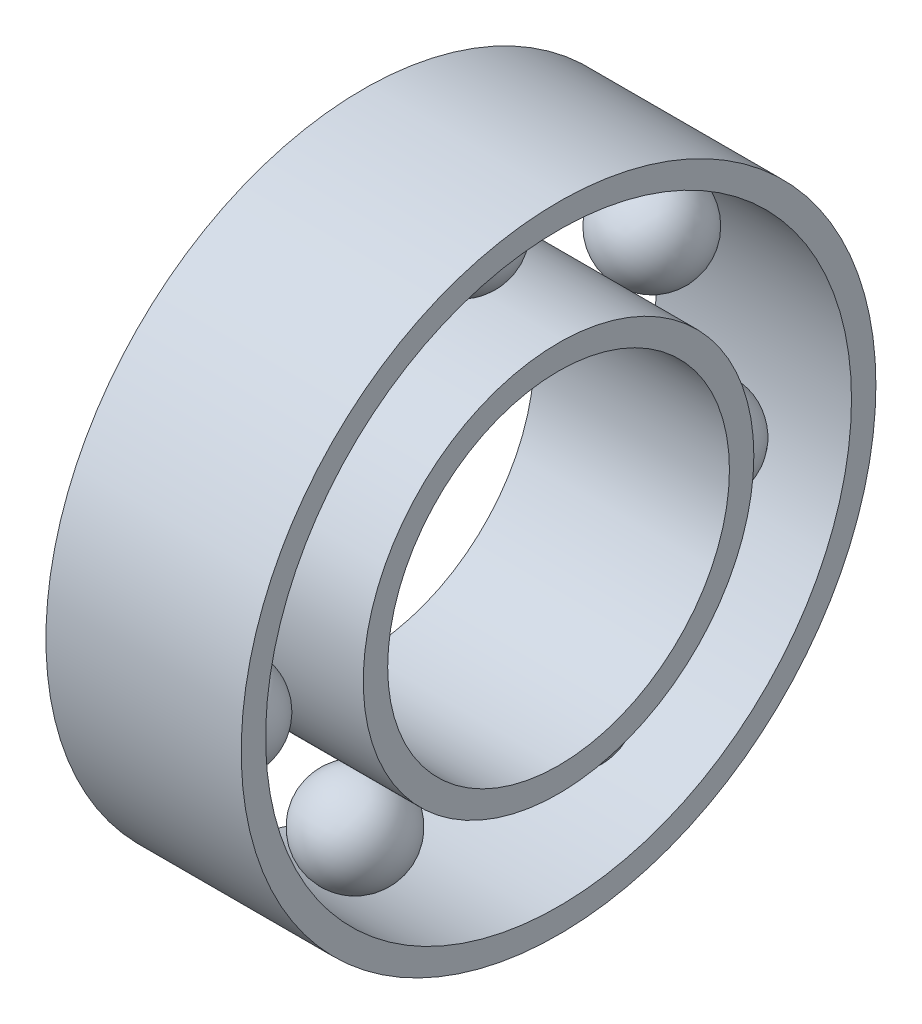
ISO-10303-21;
HEADER;
FILE_DESCRIPTION(('STEP AP214'),'2;1');
FILE_NAME('part.step','',(''),(''),'','','');
FILE_SCHEMA(('AUTOMOTIVE_DESIGN { 1 0 10303 214 1 1 1 1 }'));
ENDSEC;
DATA;
#1=APPLICATION_CONTEXT('core data for automotive mechanical design processes');
#2=APPLICATION_PROTOCOL_DEFINITION('international standard','automotive_design',2000,#1);
#3=PRODUCT_CONTEXT('',#1,'mechanical');
#4=PRODUCT('Part','Part','',(#3));
#5=PRODUCT_RELATED_PRODUCT_CATEGORY('part','',(#4));
#6=PRODUCT_DEFINITION_FORMATION('','',#4);
#7=PRODUCT_DEFINITION_CONTEXT('part definition',#1,'design');
#8=PRODUCT_DEFINITION('design','',#6,#7);
#9=PRODUCT_DEFINITION_SHAPE('','',#8);
#10=(LENGTH_UNIT() NAMED_UNIT(*) SI_UNIT(.MILLI.,.METRE.));
#11=(NAMED_UNIT(*) PLANE_ANGLE_UNIT() SI_UNIT($,.RADIAN.));
#12=(NAMED_UNIT(*) SI_UNIT($,.STERADIAN.) SOLID_ANGLE_UNIT());
#13=UNCERTAINTY_MEASURE_WITH_UNIT(LENGTH_MEASURE(1.E-05),#10,'distance_accuracy_value','');
#14=(GEOMETRIC_REPRESENTATION_CONTEXT(3) GLOBAL_UNCERTAINTY_ASSIGNED_CONTEXT((#13)) GLOBAL_UNIT_ASSIGNED_CONTEXT((#10,
#11,#12)) REPRESENTATION_CONTEXT('',''));
#15=CARTESIAN_POINT('',(0.,0.,0.));
#16=DIRECTION('',(0.,0.,1.));
#17=DIRECTION('',(1.,0.,0.));
#18=AXIS2_PLACEMENT_3D('',#15,#16,#17);
#19=CARTESIAN_POINT('',(0.,3.11744900929372,-3.90915741234011));
#20=DIRECTION('',(0.,-0.623489801858743,0.781831482468022));
#21=DIRECTION('',(0.,0.781831482468022,0.623489801858743));
#22=AXIS2_PLACEMENT_3D('',#19,#20,#21);
#23=SPHERICAL_SURFACE('',#22,1.);
#24=CARTESIAN_POINT('',(0.,2.49395920743497,-3.12732592987209));
#25=VERTEX_POINT('',#24);
#26=VERTEX_LOOP('',#25);
#27=FACE_BOUND('',#26,.T.);
#28=ADVANCED_FACE('F57',(#27),#23,.T.);
#29=CLOSED_SHELL('',(#28));
#30=MANIFOLD_SOLID_BREP('B2',#29);
#31=CARTESIAN_POINT('',(0.,-1.11260466978153,-4.87463956090913));
#32=DIRECTION('',(0.,0.222520933956305,0.974927912181826));
#33=DIRECTION('',(0.,0.974927912181826,-0.222520933956305));
#34=AXIS2_PLACEMENT_3D('',#31,#32,#33);
#35=SPHERICAL_SURFACE('',#34,1.);
#36=CARTESIAN_POINT('',(0.,-0.89008373582522,-3.8997116487273));
#37=VERTEX_POINT('',#36);
#38=VERTEX_LOOP('',#37);
#39=FACE_BOUND('',#38,.T.);
#40=ADVANCED_FACE('F71',(#39),#35,.T.);
#41=CLOSED_SHELL('',(#40));
#42=MANIFOLD_SOLID_BREP('B7',#41);
#43=CARTESIAN_POINT('',(0.,-4.50484433951208,-2.16941869558783));
#44=DIRECTION('',(0.,0.900968867902416,0.433883739117565));
#45=DIRECTION('',(0.,0.433883739117565,-0.900968867902416));
#46=AXIS2_PLACEMENT_3D('',#43,#44,#45);
#47=SPHERICAL_SURFACE('',#46,1.);
#48=CARTESIAN_POINT('',(0.,-3.60387547160966,-1.73553495647026));
#49=VERTEX_POINT('',#48);
#50=VERTEX_LOOP('',#49);
#51=FACE_BOUND('',#50,.T.);
#52=ADVANCED_FACE('F89',(#51),#47,.T.);
#53=CLOSED_SHELL('',(#52));
#54=MANIFOLD_SOLID_BREP('B55',#53);
#55=CARTESIAN_POINT('',(0.,-4.50484433951211,2.16941869558776));
#56=DIRECTION('',(0.,0.900968867902422,-0.433883739117553));
#57=DIRECTION('',(0.,-0.433883739117553,-0.900968867902422));
#58=AXIS2_PLACEMENT_3D('',#55,#56,#57);
#59=SPHERICAL_SURFACE('',#58,1.);
#60=CARTESIAN_POINT('',(0.,-3.60387547160969,1.73553495647021));
#61=VERTEX_POINT('',#60);
#62=VERTEX_LOOP('',#61);
#63=FACE_BOUND('',#62,.T.);
#64=ADVANCED_FACE('F110',(#63),#59,.T.);
#65=CLOSED_SHELL('',(#64));
#66=MANIFOLD_SOLID_BREP('B70',#65);
#67=CARTESIAN_POINT('',(0.,-1.11260466978159,4.87463956090911));
#68=DIRECTION('',(0.,0.222520933956318,-0.974927912181823));
#69=DIRECTION('',(0.,-0.974927912181823,-0.222520933956318));
#70=AXIS2_PLACEMENT_3D('',#67,#68,#69);
#71=SPHERICAL_SURFACE('',#70,1.);
#72=CARTESIAN_POINT('',(0.,-0.890083735825273,3.89971164872729));
#73=VERTEX_POINT('',#72);
#74=VERTEX_LOOP('',#73);
#75=FACE_BOUND('',#74,.T.);
#76=ADVANCED_FACE('F125',(#75),#71,.T.);
#77=CLOSED_SHELL('',(#76));
#78=MANIFOLD_SOLID_BREP('B88',#77);
#79=CARTESIAN_POINT('',(0.,3.11744900929366,3.90915741234016));
#80=DIRECTION('',(0.,-0.623489801858732,-0.781831482468031));
#81=DIRECTION('',(0.,-0.781831482468031,0.623489801858732));
#82=AXIS2_PLACEMENT_3D('',#79,#80,#81);
#83=SPHERICAL_SURFACE('',#82,1.);
#84=CARTESIAN_POINT('',(0.,2.49395920743493,3.12732592987212));
#85=VERTEX_POINT('',#84);
#86=VERTEX_LOOP('',#85);
#87=FACE_BOUND('',#86,.T.);
#88=ADVANCED_FACE('F143',(#87),#83,.T.);
#89=CLOSED_SHELL('',(#88));
#90=MANIFOLD_SOLID_BREP('B103',#89);
#91=CARTESIAN_POINT('',(0.,5.,0.));
#92=DIRECTION('',(0.,-1.,0.));
#93=DIRECTION('',(0.,0.,1.));
#94=AXIS2_PLACEMENT_3D('',#91,#92,#93);
#95=SPHERICAL_SURFACE('',#94,1.);
#96=CARTESIAN_POINT('',(0.,4.,0.));
#97=VERTEX_POINT('',#96);
#98=VERTEX_LOOP('',#97);
#99=FACE_BOUND('',#98,.T.);
#100=ADVANCED_FACE('F165',(#99),#95,.T.);
#101=CLOSED_SHELL('',(#100));
#102=MANIFOLD_SOLID_BREP('B116',#101);
#103=CARTESIAN_POINT('',(-2.,0.,0.));
#104=DIRECTION('',(1.,0.,0.));
#105=DIRECTION('',(0.,0.,-1.));
#106=AXIS2_PLACEMENT_3D('',#103,#104,#105);
#107=CYLINDRICAL_SURFACE('',#106,6.);
#108=CARTESIAN_POINT('',(0.,6.,0.));
#109=VERTEX_POINT('',#108);
#110=VERTEX_LOOP('',#109);
#111=FACE_BOUND('',#110,.T.);
#112=CARTESIAN_POINT('',(-2.,0.,0.));
#113=DIRECTION('',(1.,0.,0.));
#114=DIRECTION('',(0.,0.,-1.));
#115=AXIS2_PLACEMENT_3D('',#112,#113,#114);
#116=CIRCLE('',#115,6.);
#117=CARTESIAN_POINT('',(-2.,0.,-6.));
#118=VERTEX_POINT('',#117);
#119=EDGE_CURVE('E187',#118,#118,#116,.T.);
#120=ORIENTED_EDGE('',*,*,#119,.F.);
#121=EDGE_LOOP('',(#120));
#122=FACE_BOUND('',#121,.T.);
#123=CARTESIAN_POINT('',(2.,0.,0.));
#124=DIRECTION('',(1.,0.,0.));
#125=DIRECTION('',(0.,0.,-1.));
#126=AXIS2_PLACEMENT_3D('',#123,#124,#125);
#127=CIRCLE('',#126,6.);
#128=CARTESIAN_POINT('',(2.,0.,-6.));
#129=VERTEX_POINT('',#128);
#130=EDGE_CURVE('E200',#129,#129,#127,.T.);
#131=ORIENTED_EDGE('',*,*,#130,.T.);
#132=EDGE_LOOP('',(#131));
#133=FACE_BOUND('',#132,.T.);
#134=ADVANCED_FACE('F185',(#111,#122,#133),#107,.F.);
#135=CARTESIAN_POINT('',(-2.,0.,0.));
#136=DIRECTION('',(1.,0.,0.));
#137=DIRECTION('',(0.,0.,-1.));
#138=AXIS2_PLACEMENT_3D('',#135,#136,#137);
#139=CYLINDRICAL_SURFACE('',#138,6.5);
#140=CARTESIAN_POINT('',(-2.,0.,0.));
#141=DIRECTION('',(1.,0.,0.));
#142=DIRECTION('',(0.,0.,-1.));
#143=AXIS2_PLACEMENT_3D('',#140,#141,#142);
#144=CIRCLE('',#143,6.5);
#145=CARTESIAN_POINT('',(-2.,0.,-6.5));
#146=VERTEX_POINT('',#145);
#147=EDGE_CURVE('E159',#146,#146,#144,.T.);
#148=ORIENTED_EDGE('',*,*,#147,.T.);
#149=EDGE_LOOP('',(#148));
#150=FACE_BOUND('',#149,.T.);
#151=CARTESIAN_POINT('',(2.,0.,0.));
#152=DIRECTION('',(1.,0.,0.));
#153=DIRECTION('',(0.,0.,-1.));
#154=AXIS2_PLACEMENT_3D('',#151,#152,#153);
#155=CIRCLE('',#154,6.5);
#156=CARTESIAN_POINT('',(2.,0.,-6.5));
#157=VERTEX_POINT('',#156);
#158=EDGE_CURVE('E203',#157,#157,#155,.T.);
#159=ORIENTED_EDGE('',*,*,#158,.F.);
#160=EDGE_LOOP('',(#159));
#161=FACE_BOUND('',#160,.T.);
#162=ADVANCED_FACE('F192',(#150,#161),#139,.T.);
#163=CARTESIAN_POINT('',(-2.,0.,0.));
#164=DIRECTION('',(1.,0.,0.));
#165=DIRECTION('',(0.,0.,-1.));
#166=AXIS2_PLACEMENT_3D('',#163,#164,#165);
#167=PLANE('',#166);
#168=ORIENTED_EDGE('',*,*,#119,.T.);
#169=EDGE_LOOP('',(#168));
#170=FACE_BOUND('',#169,.T.);
#171=ORIENTED_EDGE('',*,*,#147,.F.);
#172=EDGE_LOOP('',(#171));
#173=FACE_BOUND('',#172,.T.);
#174=ADVANCED_FACE('F206',(#170,#173),#167,.F.);
#175=CARTESIAN_POINT('',(2.,0.,0.));
#176=DIRECTION('',(1.,0.,0.));
#177=DIRECTION('',(0.,0.,-1.));
#178=AXIS2_PLACEMENT_3D('',#175,#176,#177);
#179=PLANE('',#178);
#180=ORIENTED_EDGE('',*,*,#130,.F.);
#181=EDGE_LOOP('',(#180));
#182=FACE_BOUND('',#181,.T.);
#183=ORIENTED_EDGE('',*,*,#158,.T.);
#184=EDGE_LOOP('',(#183));
#185=FACE_BOUND('',#184,.T.);
#186=ADVANCED_FACE('F207',(#182,#185),#179,.T.);
#187=CLOSED_SHELL('',(#134,#162,#174,#186));
#188=MANIFOLD_SOLID_BREP('B139',#187);
#189=CARTESIAN_POINT('',(-2.,0.,0.));
#190=DIRECTION('',(1.,0.,0.));
#191=DIRECTION('',(0.,0.,-1.));
#192=AXIS2_PLACEMENT_3D('',#189,#190,#191);
#193=CYLINDRICAL_SURFACE('',#192,3.5);
#194=CARTESIAN_POINT('',(-2.,0.,0.));
#195=DIRECTION('',(1.,0.,0.));
#196=DIRECTION('',(0.,0.,-1.));
#197=AXIS2_PLACEMENT_3D('',#194,#195,#196);
#198=CIRCLE('',#197,3.5);
#199=CARTESIAN_POINT('',(-2.,0.,-3.5));
#200=VERTEX_POINT('',#199);
#201=EDGE_CURVE('E245',#200,#200,#198,.T.);
#202=ORIENTED_EDGE('',*,*,#201,.F.);
#203=EDGE_LOOP('',(#202));
#204=FACE_BOUND('',#203,.T.);
#205=CARTESIAN_POINT('',(2.,0.,0.));
#206=DIRECTION('',(1.,0.,0.));
#207=DIRECTION('',(0.,0.,-1.));
#208=AXIS2_PLACEMENT_3D('',#205,#206,#207);
#209=CIRCLE('',#208,3.5);
#210=CARTESIAN_POINT('',(2.,0.,-3.5));
#211=VERTEX_POINT('',#210);
#212=EDGE_CURVE('E260',#211,#211,#209,.T.);
#213=ORIENTED_EDGE('',*,*,#212,.T.);
#214=EDGE_LOOP('',(#213));
#215=FACE_BOUND('',#214,.T.);
#216=ADVANCED_FACE('F236',(#204,#215),#193,.F.);
#217=CARTESIAN_POINT('',(-2.,0.,0.));
#218=DIRECTION('',(1.,0.,0.));
#219=DIRECTION('',(0.,0.,-1.));
#220=AXIS2_PLACEMENT_3D('',#217,#218,#219);
#221=CYLINDRICAL_SURFACE('',#220,4.);
#222=CARTESIAN_POINT('',(0.,4.,0.));
#223=VERTEX_POINT('',#222);
#224=VERTEX_LOOP('',#223);
#225=FACE_BOUND('',#224,.T.);
#226=CARTESIAN_POINT('',(-2.,0.,0.));
#227=DIRECTION('',(1.,0.,0.));
#228=DIRECTION('',(0.,0.,-1.));
#229=AXIS2_PLACEMENT_3D('',#226,#227,#228);
#230=CIRCLE('',#229,4.);
#231=CARTESIAN_POINT('',(-2.,0.,-4.));
#232=VERTEX_POINT('',#231);
#233=EDGE_CURVE('E176',#232,#232,#230,.T.);
#234=ORIENTED_EDGE('',*,*,#233,.T.);
#235=EDGE_LOOP('',(#234));
#236=FACE_BOUND('',#235,.T.);
#237=CARTESIAN_POINT('',(2.,0.,0.));
#238=DIRECTION('',(1.,0.,0.));
#239=DIRECTION('',(0.,0.,-1.));
#240=AXIS2_PLACEMENT_3D('',#237,#238,#239);
#241=CIRCLE('',#240,4.);
#242=CARTESIAN_POINT('',(2.,0.,-4.));
#243=VERTEX_POINT('',#242);
#244=EDGE_CURVE('E254',#243,#243,#241,.T.);
#245=ORIENTED_EDGE('',*,*,#244,.F.);
#246=EDGE_LOOP('',(#245));
#247=FACE_BOUND('',#246,.T.);
#248=ADVANCED_FACE('F249',(#225,#236,#247),#221,.T.);
#249=CARTESIAN_POINT('',(-2.,0.,0.));
#250=DIRECTION('',(1.,0.,0.));
#251=DIRECTION('',(0.,0.,-1.));
#252=AXIS2_PLACEMENT_3D('',#249,#250,#251);
#253=PLANE('',#252);
#254=ORIENTED_EDGE('',*,*,#201,.T.);
#255=EDGE_LOOP('',(#254));
#256=FACE_BOUND('',#255,.T.);
#257=ORIENTED_EDGE('',*,*,#233,.F.);
#258=EDGE_LOOP('',(#257));
#259=FACE_BOUND('',#258,.T.);
#260=ADVANCED_FACE('F246',(#256,#259),#253,.F.);
#261=CARTESIAN_POINT('',(2.,0.,0.));
#262=DIRECTION('',(1.,0.,0.));
#263=DIRECTION('',(0.,0.,-1.));
#264=AXIS2_PLACEMENT_3D('',#261,#262,#263);
#265=PLANE('',#264);
#266=ORIENTED_EDGE('',*,*,#212,.F.);
#267=EDGE_LOOP('',(#266));
#268=FACE_BOUND('',#267,.T.);
#269=ORIENTED_EDGE('',*,*,#244,.T.);
#270=EDGE_LOOP('',(#269));
#271=FACE_BOUND('',#270,.T.);
#272=ADVANCED_FACE('F264',(#268,#271),#265,.T.);
#273=CLOSED_SHELL('',(#216,#248,#260,#272));
#274=MANIFOLD_SOLID_BREP('B152',#273);
#275=ADVANCED_BREP_SHAPE_REPRESENTATION('',(#18,#30,#42,#54,#66,#78,#90,#102,#188,#274),#14);
#276=SHAPE_DEFINITION_REPRESENTATION(#9,#275);
ENDSEC;
END-ISO-10303-21;
